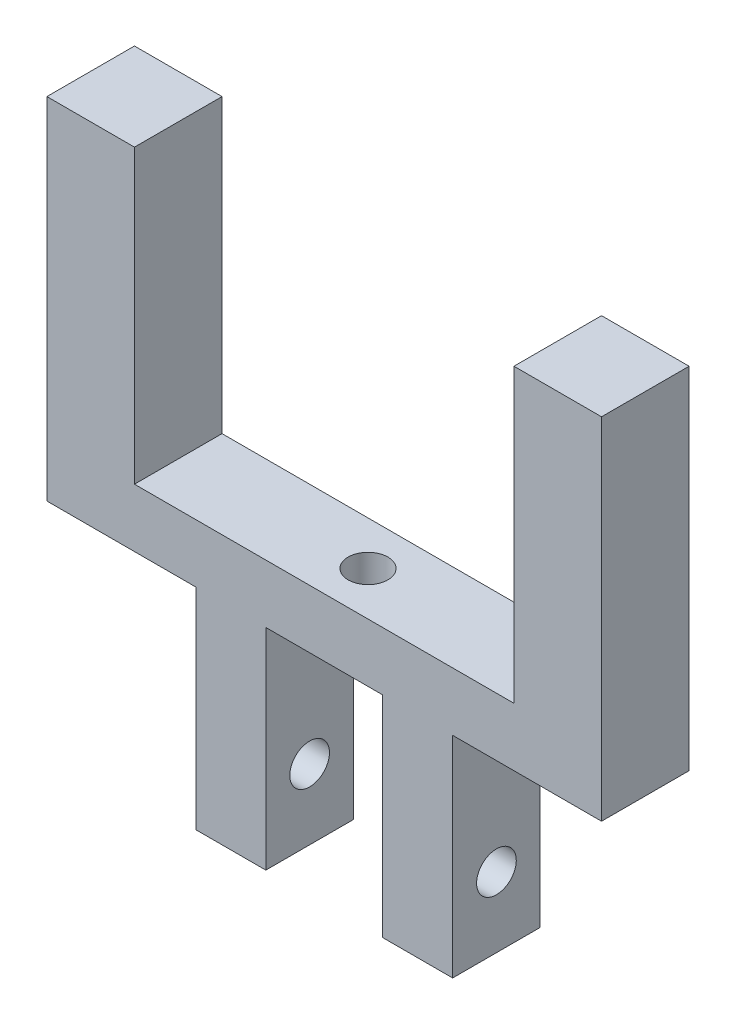
ISO-10303-21;
HEADER;
FILE_DESCRIPTION(('STEP AP214'),'2;1');
FILE_NAME('part.step','',(''),(''),'','','');
FILE_SCHEMA(('AUTOMOTIVE_DESIGN { 1 0 10303 214 1 1 1 1 }'));
ENDSEC;
DATA;
#1=APPLICATION_CONTEXT('core data for automotive mechanical design processes');
#2=APPLICATION_PROTOCOL_DEFINITION('international standard','automotive_design',2000,#1);
#3=PRODUCT_CONTEXT('',#1,'mechanical');
#4=PRODUCT('Part','Part','',(#3));
#5=PRODUCT_RELATED_PRODUCT_CATEGORY('part','',(#4));
#6=PRODUCT_DEFINITION_FORMATION('','',#4);
#7=PRODUCT_DEFINITION_CONTEXT('part definition',#1,'design');
#8=PRODUCT_DEFINITION('design','',#6,#7);
#9=PRODUCT_DEFINITION_SHAPE('','',#8);
#10=(LENGTH_UNIT() NAMED_UNIT(*) SI_UNIT(.MILLI.,.METRE.));
#11=(NAMED_UNIT(*) PLANE_ANGLE_UNIT() SI_UNIT($,.RADIAN.));
#12=(NAMED_UNIT(*) SI_UNIT($,.STERADIAN.) SOLID_ANGLE_UNIT());
#13=UNCERTAINTY_MEASURE_WITH_UNIT(LENGTH_MEASURE(1.E-05),#10,'distance_accuracy_value','');
#14=(GEOMETRIC_REPRESENTATION_CONTEXT(3) GLOBAL_UNCERTAINTY_ASSIGNED_CONTEXT((#13)) GLOBAL_UNIT_ASSIGNED_CONTEXT((#10,
#11,#12)) REPRESENTATION_CONTEXT('',''));
#15=CARTESIAN_POINT('',(0.,0.,0.));
#16=DIRECTION('',(0.,0.,1.));
#17=DIRECTION('',(1.,0.,0.));
#18=AXIS2_PLACEMENT_3D('',#15,#16,#17);
#19=CARTESIAN_POINT('',(-16.25,0.,7.5));
#20=DIRECTION('',(0.,-1.,0.));
#21=DIRECTION('',(1.,0.,0.));
#22=AXIS2_PLACEMENT_3D('',#19,#20,#21);
#23=PLANE('',#22);
#24=DIRECTION('',(-1.,0.,0.));
#25=VECTOR('',#24,1.);
#26=CARTESIAN_POINT('',(-16.25,0.,0.));
#27=LINE('',#26,#25);
#28=CARTESIAN_POINT('',(-16.25,0.,0.));
#29=VERTEX_POINT('',#28);
#30=CARTESIAN_POINT('',(-23.75,0.,0.));
#31=VERTEX_POINT('',#30);
#32=EDGE_CURVE('E146',#29,#31,#27,.T.);
#33=ORIENTED_EDGE('',*,*,#32,.T.);
#34=DIRECTION('',(0.,0.,-1.));
#35=VECTOR('',#34,1.);
#36=CARTESIAN_POINT('',(-23.75,0.,7.5));
#37=LINE('',#36,#35);
#38=CARTESIAN_POINT('',(-23.75,0.,7.5));
#39=VERTEX_POINT('',#38);
#40=EDGE_CURVE('E11',#39,#31,#37,.T.);
#41=ORIENTED_EDGE('',*,*,#40,.F.);
#42=DIRECTION('',(-1.,0.,0.));
#43=VECTOR('',#42,1.);
#44=CARTESIAN_POINT('',(-16.25,0.,7.5));
#45=LINE('',#44,#43);
#46=CARTESIAN_POINT('',(-16.25,0.,7.5));
#47=VERTEX_POINT('',#46);
#48=EDGE_CURVE('E164',#47,#39,#45,.T.);
#49=ORIENTED_EDGE('',*,*,#48,.F.);
#50=DIRECTION('',(0.,0.,-1.));
#51=VECTOR('',#50,1.);
#52=CARTESIAN_POINT('',(-16.25,0.,7.5));
#53=LINE('',#52,#51);
#54=EDGE_CURVE('E145',#47,#29,#53,.T.);
#55=ORIENTED_EDGE('',*,*,#54,.T.);
#56=EDGE_LOOP('',(#33,#41,#49,#55));
#57=FACE_BOUND('',#56,.T.);
#58=ADVANCED_FACE('F33',(#57),#23,.F.);
#59=CARTESIAN_POINT('',(-23.75,0.,7.5));
#60=DIRECTION('',(1.,0.,0.));
#61=DIRECTION('',(0.,1.,0.));
#62=AXIS2_PLACEMENT_3D('',#59,#60,#61);
#63=PLANE('',#62);
#64=DIRECTION('',(0.,-1.,0.));
#65=VECTOR('',#64,1.);
#66=CARTESIAN_POINT('',(-23.75,0.,0.));
#67=LINE('',#66,#65);
#68=CARTESIAN_POINT('',(-23.75,-30.,0.));
#69=VERTEX_POINT('',#68);
#70=EDGE_CURVE('E149',#31,#69,#67,.T.);
#71=ORIENTED_EDGE('',*,*,#70,.T.);
#72=DIRECTION('',(0.,0.,-1.));
#73=VECTOR('',#72,1.);
#74=CARTESIAN_POINT('',(-23.75,-30.,7.5));
#75=LINE('',#74,#73);
#76=CARTESIAN_POINT('',(-23.75,-30.,7.5));
#77=VERTEX_POINT('',#76);
#78=EDGE_CURVE('E42',#77,#69,#75,.T.);
#79=ORIENTED_EDGE('',*,*,#78,.F.);
#80=DIRECTION('',(0.,-1.,0.));
#81=VECTOR('',#80,1.);
#82=CARTESIAN_POINT('',(-23.75,0.,7.5));
#83=LINE('',#82,#81);
#84=EDGE_CURVE('E94',#39,#77,#83,.T.);
#85=ORIENTED_EDGE('',*,*,#84,.F.);
#86=ORIENTED_EDGE('',*,*,#40,.T.);
#87=EDGE_LOOP('',(#71,#79,#85,#86));
#88=FACE_BOUND('',#87,.T.);
#89=ADVANCED_FACE('F292',(#88),#63,.F.);
#90=CARTESIAN_POINT('',(-23.75,-30.,7.5));
#91=DIRECTION('',(0.,1.,0.));
#92=DIRECTION('',(0.,0.,1.));
#93=AXIS2_PLACEMENT_3D('',#90,#91,#92);
#94=PLANE('',#93);
#95=DIRECTION('',(1.,0.,0.));
#96=VECTOR('',#95,1.);
#97=CARTESIAN_POINT('',(-23.75,-30.,0.));
#98=LINE('',#97,#96);
#99=CARTESIAN_POINT('',(-11.,-30.,0.));
#100=VERTEX_POINT('',#99);
#101=EDGE_CURVE('E152',#69,#100,#98,.T.);
#102=ORIENTED_EDGE('',*,*,#101,.T.);
#103=DIRECTION('',(0.,0.,-1.));
#104=VECTOR('',#103,1.);
#105=CARTESIAN_POINT('',(-11.,-30.,7.5));
#106=LINE('',#105,#104);
#107=CARTESIAN_POINT('',(-11.,-30.,7.5));
#108=VERTEX_POINT('',#107);
#109=EDGE_CURVE('E171',#108,#100,#106,.T.);
#110=ORIENTED_EDGE('',*,*,#109,.F.);
#111=DIRECTION('',(1.,0.,0.));
#112=VECTOR('',#111,1.);
#113=CARTESIAN_POINT('',(-23.75,-30.,7.5));
#114=LINE('',#113,#112);
#115=EDGE_CURVE('E180',#77,#108,#114,.T.);
#116=ORIENTED_EDGE('',*,*,#115,.F.);
#117=ORIENTED_EDGE('',*,*,#78,.T.);
#118=EDGE_LOOP('',(#102,#110,#116,#117));
#119=FACE_BOUND('',#118,.T.);
#120=ADVANCED_FACE('F178',(#119),#94,.F.);
#121=CARTESIAN_POINT('',(-11.,-48.,7.5));
#122=DIRECTION('',(1.,0.,0.));
#123=DIRECTION('',(0.,1.,0.));
#124=AXIS2_PLACEMENT_3D('',#121,#122,#123);
#125=PLANE('',#124);
#126=CARTESIAN_POINT('',(-11.,-42.,3.75));
#127=DIRECTION('',(1.,0.,0.));
#128=DIRECTION('',(0.,1.,0.));
#129=AXIS2_PLACEMENT_3D('',#126,#127,#128);
#130=CIRCLE('',#129,1.7);
#131=CARTESIAN_POINT('',(-11.,-40.3,3.75));
#132=VERTEX_POINT('',#131);
#133=EDGE_CURVE('E241',#132,#132,#130,.T.);
#134=ORIENTED_EDGE('',*,*,#133,.T.);
#135=EDGE_LOOP('',(#134));
#136=FACE_BOUND('',#135,.T.);
#137=DIRECTION('',(0.,-1.,0.));
#138=VECTOR('',#137,1.);
#139=CARTESIAN_POINT('',(-11.,-48.,0.));
#140=LINE('',#139,#138);
#141=CARTESIAN_POINT('',(-11.,-48.,0.));
#142=VERTEX_POINT('',#141);
#143=EDGE_CURVE('E154',#100,#142,#140,.T.);
#144=ORIENTED_EDGE('',*,*,#143,.T.);
#145=DIRECTION('',(0.,0.,-1.));
#146=VECTOR('',#145,1.);
#147=CARTESIAN_POINT('',(-11.,-48.,7.5));
#148=LINE('',#147,#146);
#149=CARTESIAN_POINT('',(-11.,-48.,7.5));
#150=VERTEX_POINT('',#149);
#151=EDGE_CURVE('E168',#150,#142,#148,.T.);
#152=ORIENTED_EDGE('',*,*,#151,.F.);
#153=DIRECTION('',(0.,-1.,0.));
#154=VECTOR('',#153,1.);
#155=CARTESIAN_POINT('',(-11.,-48.,7.5));
#156=LINE('',#155,#154);
#157=EDGE_CURVE('E192',#108,#150,#156,.T.);
#158=ORIENTED_EDGE('',*,*,#157,.F.);
#159=ORIENTED_EDGE('',*,*,#109,.T.);
#160=EDGE_LOOP('',(#144,#152,#158,#159));
#161=FACE_BOUND('',#160,.T.);
#162=ADVANCED_FACE('F188',(#136,#161),#125,.F.);
#163=CARTESIAN_POINT('',(-11.,-48.,7.5));
#164=DIRECTION('',(0.,1.,0.));
#165=DIRECTION('',(0.,0.,1.));
#166=AXIS2_PLACEMENT_3D('',#163,#164,#165);
#167=PLANE('',#166);
#168=DIRECTION('',(1.,0.,0.));
#169=VECTOR('',#168,1.);
#170=CARTESIAN_POINT('',(-11.,-48.,0.));
#171=LINE('',#170,#169);
#172=CARTESIAN_POINT('',(-4.99999999999999,-48.,0.));
#173=VERTEX_POINT('',#172);
#174=EDGE_CURVE('E156',#142,#173,#171,.T.);
#175=ORIENTED_EDGE('',*,*,#174,.T.);
#176=DIRECTION('',(0.,0.,-1.));
#177=VECTOR('',#176,1.);
#178=CARTESIAN_POINT('',(-4.99999999999999,-48.,7.5));
#179=LINE('',#178,#177);
#180=CARTESIAN_POINT('',(-4.99999999999999,-48.,7.5));
#181=VERTEX_POINT('',#180);
#182=EDGE_CURVE('E132',#181,#173,#179,.T.);
#183=ORIENTED_EDGE('',*,*,#182,.F.);
#184=DIRECTION('',(1.,0.,0.));
#185=VECTOR('',#184,1.);
#186=CARTESIAN_POINT('',(-11.,-48.,7.5));
#187=LINE('',#186,#185);
#188=EDGE_CURVE('E120',#150,#181,#187,.T.);
#189=ORIENTED_EDGE('',*,*,#188,.F.);
#190=ORIENTED_EDGE('',*,*,#151,.T.);
#191=EDGE_LOOP('',(#175,#183,#189,#190));
#192=FACE_BOUND('',#191,.T.);
#193=ADVANCED_FACE('F191',(#192),#167,.F.);
#194=CARTESIAN_POINT('',(-5.,-40.,7.5));
#195=DIRECTION('',(-1.,0.,0.));
#196=DIRECTION('',(0.,0.,1.));
#197=AXIS2_PLACEMENT_3D('',#194,#195,#196);
#198=PLANE('',#197);
#199=CARTESIAN_POINT('',(-5.,-42.,3.75));
#200=DIRECTION('',(-1.,0.,0.));
#201=DIRECTION('',(0.,0.,1.));
#202=AXIS2_PLACEMENT_3D('',#199,#200,#201);
#203=CIRCLE('',#202,1.7);
#204=CARTESIAN_POINT('',(-5.,-42.,5.45));
#205=VERTEX_POINT('',#204);
#206=EDGE_CURVE('E262',#205,#205,#203,.T.);
#207=ORIENTED_EDGE('',*,*,#206,.T.);
#208=EDGE_LOOP('',(#207));
#209=FACE_BOUND('',#208,.T.);
#210=DIRECTION('',(0.,1.,0.));
#211=VECTOR('',#210,1.);
#212=CARTESIAN_POINT('',(-5.,-40.,0.));
#213=LINE('',#212,#211);
#214=CARTESIAN_POINT('',(-5.,-30.,0.));
#215=VERTEX_POINT('',#214);
#216=EDGE_CURVE('E128',#173,#215,#213,.T.);
#217=ORIENTED_EDGE('',*,*,#216,.T.);
#218=DIRECTION('',(0.,0.,-1.));
#219=VECTOR('',#218,1.);
#220=CARTESIAN_POINT('',(-5.,-30.,7.5));
#221=LINE('',#220,#219);
#222=CARTESIAN_POINT('',(-5.,-30.,7.5));
#223=VERTEX_POINT('',#222);
#224=EDGE_CURVE('E126',#223,#215,#221,.T.);
#225=ORIENTED_EDGE('',*,*,#224,.F.);
#226=DIRECTION('',(0.,1.,0.));
#227=VECTOR('',#226,1.);
#228=CARTESIAN_POINT('',(-4.99999999999999,-48.,7.5));
#229=LINE('',#228,#227);
#230=EDGE_CURVE('E111',#181,#223,#229,.T.);
#231=ORIENTED_EDGE('',*,*,#230,.F.);
#232=ORIENTED_EDGE('',*,*,#182,.T.);
#233=EDGE_LOOP('',(#217,#225,#231,#232));
#234=FACE_BOUND('',#233,.T.);
#235=ADVANCED_FACE('F127',(#209,#234),#198,.F.);
#236=CARTESIAN_POINT('',(-5.,-30.,7.5));
#237=DIRECTION('',(0.,1.,0.));
#238=DIRECTION('',(0.,0.,1.));
#239=AXIS2_PLACEMENT_3D('',#236,#237,#238);
#240=PLANE('',#239);
#241=CARTESIAN_POINT('',(0.,-30.,3.75));
#242=DIRECTION('',(0.,1.,0.));
#243=DIRECTION('',(0.,0.,1.));
#244=AXIS2_PLACEMENT_3D('',#241,#242,#243);
#245=CIRCLE('',#244,1.7);
#246=CARTESIAN_POINT('',(-1.70000000000001,-30.,3.75));
#247=VERTEX_POINT('',#246);
#248=EDGE_CURVE('E271',#247,#247,#245,.T.);
#249=ORIENTED_EDGE('',*,*,#248,.T.);
#250=EDGE_LOOP('',(#249));
#251=FACE_BOUND('',#250,.T.);
#252=DIRECTION('',(1.,0.,0.));
#253=VECTOR('',#252,1.);
#254=CARTESIAN_POINT('',(-5.,-30.,0.));
#255=LINE('',#254,#253);
#256=CARTESIAN_POINT('',(5.,-30.,0.));
#257=VERTEX_POINT('',#256);
#258=EDGE_CURVE('E160',#215,#257,#255,.T.);
#259=ORIENTED_EDGE('',*,*,#258,.T.);
#260=DIRECTION('',(0.,0.,-1.));
#261=VECTOR('',#260,1.);
#262=CARTESIAN_POINT('',(5.,-30.,7.5));
#263=LINE('',#262,#261);
#264=CARTESIAN_POINT('',(5.,-30.,7.5));
#265=VERTEX_POINT('',#264);
#266=EDGE_CURVE('E137',#265,#257,#263,.T.);
#267=ORIENTED_EDGE('',*,*,#266,.F.);
#268=DIRECTION('',(1.,0.,0.));
#269=VECTOR('',#268,1.);
#270=CARTESIAN_POINT('',(-5.,-30.,7.5));
#271=LINE('',#270,#269);
#272=EDGE_CURVE('E117',#223,#265,#271,.T.);
#273=ORIENTED_EDGE('',*,*,#272,.F.);
#274=ORIENTED_EDGE('',*,*,#224,.T.);
#275=EDGE_LOOP('',(#259,#267,#273,#274));
#276=FACE_BOUND('',#275,.T.);
#277=ADVANCED_FACE('F135',(#251,#276),#240,.F.);
#278=CARTESIAN_POINT('',(0.,-25.,7.5));
#279=DIRECTION('',(0.,-1.,0.));
#280=DIRECTION('',(0.,0.,-1.));
#281=AXIS2_PLACEMENT_3D('',#278,#279,#280);
#282=PLANE('',#281);
#283=CARTESIAN_POINT('',(0.,-25.,3.75));
#284=DIRECTION('',(0.,-1.,0.));
#285=DIRECTION('',(0.,0.,-1.));
#286=AXIS2_PLACEMENT_3D('',#283,#284,#285);
#287=CIRCLE('',#286,1.7);
#288=CARTESIAN_POINT('',(-1.70000000000001,-25.,3.75));
#289=VERTEX_POINT('',#288);
#290=EDGE_CURVE('E36',#289,#289,#287,.T.);
#291=ORIENTED_EDGE('',*,*,#290,.T.);
#292=EDGE_LOOP('',(#291));
#293=FACE_BOUND('',#292,.T.);
#294=DIRECTION('',(-1.,0.,0.));
#295=VECTOR('',#294,1.);
#296=CARTESIAN_POINT('',(0.,-25.,0.));
#297=LINE('',#296,#295);
#298=CARTESIAN_POINT('',(16.25,-25.,0.));
#299=VERTEX_POINT('',#298);
#300=CARTESIAN_POINT('',(-16.25,-25.,0.));
#301=VERTEX_POINT('',#300);
#302=EDGE_CURVE('E80',#299,#301,#297,.T.);
#303=ORIENTED_EDGE('',*,*,#302,.T.);
#304=DIRECTION('',(0.,0.,-1.));
#305=VECTOR('',#304,1.);
#306=CARTESIAN_POINT('',(-16.25,-25.,7.5));
#307=LINE('',#306,#305);
#308=CARTESIAN_POINT('',(-16.25,-25.,7.5));
#309=VERTEX_POINT('',#308);
#310=EDGE_CURVE('E133',#309,#301,#307,.T.);
#311=ORIENTED_EDGE('',*,*,#310,.F.);
#312=DIRECTION('',(-1.,0.,0.));
#313=VECTOR('',#312,1.);
#314=CARTESIAN_POINT('',(0.,-25.,7.5));
#315=LINE('',#314,#313);
#316=CARTESIAN_POINT('',(16.25,-25.,7.5));
#317=VERTEX_POINT('',#316);
#318=EDGE_CURVE('E139',#317,#309,#315,.T.);
#319=ORIENTED_EDGE('',*,*,#318,.F.);
#320=DIRECTION('',(0.,0.,-1.));
#321=VECTOR('',#320,1.);
#322=CARTESIAN_POINT('',(16.25,-25.,7.5));
#323=LINE('',#322,#321);
#324=EDGE_CURVE('E200',#317,#299,#323,.T.);
#325=ORIENTED_EDGE('',*,*,#324,.T.);
#326=EDGE_LOOP('',(#303,#311,#319,#325));
#327=FACE_BOUND('',#326,.T.);
#328=ADVANCED_FACE('F278',(#293,#327),#282,.F.);
#329=CARTESIAN_POINT('',(-16.25,-25.,7.5));
#330=DIRECTION('',(-1.,0.,0.));
#331=DIRECTION('',(0.,-1.,0.));
#332=AXIS2_PLACEMENT_3D('',#329,#330,#331);
#333=PLANE('',#332);
#334=DIRECTION('',(0.,1.,0.));
#335=VECTOR('',#334,1.);
#336=CARTESIAN_POINT('',(-16.25,-25.,0.));
#337=LINE('',#336,#335);
#338=EDGE_CURVE('E86',#301,#29,#337,.T.);
#339=ORIENTED_EDGE('',*,*,#338,.T.);
#340=ORIENTED_EDGE('',*,*,#54,.F.);
#341=DIRECTION('',(0.,1.,0.));
#342=VECTOR('',#341,1.);
#343=CARTESIAN_POINT('',(-16.25,-25.,7.5));
#344=LINE('',#343,#342);
#345=EDGE_CURVE('E50',#309,#47,#344,.T.);
#346=ORIENTED_EDGE('',*,*,#345,.F.);
#347=ORIENTED_EDGE('',*,*,#310,.T.);
#348=EDGE_LOOP('',(#339,#340,#346,#347));
#349=FACE_BOUND('',#348,.T.);
#350=ADVANCED_FACE('F361',(#349),#333,.F.);
#351=CARTESIAN_POINT('',(0.,0.,7.5));
#352=DIRECTION('',(0.,0.,1.));
#353=DIRECTION('',(1.,0.,0.));
#354=AXIS2_PLACEMENT_3D('',#351,#352,#353);
#355=PLANE('',#354);
#356=ORIENTED_EDGE('',*,*,#48,.T.);
#357=ORIENTED_EDGE('',*,*,#84,.T.);
#358=ORIENTED_EDGE('',*,*,#115,.T.);
#359=ORIENTED_EDGE('',*,*,#157,.T.);
#360=ORIENTED_EDGE('',*,*,#188,.T.);
#361=ORIENTED_EDGE('',*,*,#230,.T.);
#362=ORIENTED_EDGE('',*,*,#272,.T.);
#363=DIRECTION('',(0.,1.,0.));
#364=VECTOR('',#363,1.);
#365=CARTESIAN_POINT('',(5.,-40.,7.5));
#366=LINE('',#365,#364);
#367=CARTESIAN_POINT('',(4.99999999999999,-48.,7.5));
#368=VERTEX_POINT('',#367);
#369=EDGE_CURVE('E253',#368,#265,#366,.T.);
#370=ORIENTED_EDGE('',*,*,#369,.F.);
#371=DIRECTION('',(-1.,0.,0.));
#372=VECTOR('',#371,1.);
#373=CARTESIAN_POINT('',(11.,-48.,7.5));
#374=LINE('',#373,#372);
#375=CARTESIAN_POINT('',(11.,-48.,7.5));
#376=VERTEX_POINT('',#375);
#377=EDGE_CURVE('E250',#376,#368,#374,.T.);
#378=ORIENTED_EDGE('',*,*,#377,.F.);
#379=DIRECTION('',(0.,-1.,0.));
#380=VECTOR('',#379,1.);
#381=CARTESIAN_POINT('',(11.,-48.,7.5));
#382=LINE('',#381,#380);
#383=CARTESIAN_POINT('',(11.,-30.,7.5));
#384=VERTEX_POINT('',#383);
#385=EDGE_CURVE('E247',#384,#376,#382,.T.);
#386=ORIENTED_EDGE('',*,*,#385,.F.);
#387=DIRECTION('',(-1.,0.,0.));
#388=VECTOR('',#387,1.);
#389=CARTESIAN_POINT('',(23.75,-30.,7.5));
#390=LINE('',#389,#388);
#391=CARTESIAN_POINT('',(23.75,-30.,7.5));
#392=VERTEX_POINT('',#391);
#393=EDGE_CURVE('E244',#392,#384,#390,.T.);
#394=ORIENTED_EDGE('',*,*,#393,.F.);
#395=DIRECTION('',(0.,-1.,0.));
#396=VECTOR('',#395,1.);
#397=CARTESIAN_POINT('',(23.75,0.,7.5));
#398=LINE('',#397,#396);
#399=CARTESIAN_POINT('',(23.75,0.,7.5));
#400=VERTEX_POINT('',#399);
#401=EDGE_CURVE('E218',#400,#392,#398,.T.);
#402=ORIENTED_EDGE('',*,*,#401,.F.);
#403=DIRECTION('',(1.,0.,0.));
#404=VECTOR('',#403,1.);
#405=CARTESIAN_POINT('',(16.25,0.,7.5));
#406=LINE('',#405,#404);
#407=CARTESIAN_POINT('',(16.25,0.,7.5));
#408=VERTEX_POINT('',#407);
#409=EDGE_CURVE('E222',#408,#400,#406,.T.);
#410=ORIENTED_EDGE('',*,*,#409,.F.);
#411=DIRECTION('',(0.,1.,0.));
#412=VECTOR('',#411,1.);
#413=CARTESIAN_POINT('',(16.25,-25.,7.5));
#414=LINE('',#413,#412);
#415=EDGE_CURVE('E255',#317,#408,#414,.T.);
#416=ORIENTED_EDGE('',*,*,#415,.F.);
#417=ORIENTED_EDGE('',*,*,#318,.T.);
#418=ORIENTED_EDGE('',*,*,#345,.T.);
#419=EDGE_LOOP('',(#356,#357,#358,#359,#360,#361,#362,#370,#378,#386,#394,#402,#410,#416,#417,#418));
#420=FACE_BOUND('',#419,.T.);
#421=ADVANCED_FACE('F113',(#420),#355,.T.);
#422=CARTESIAN_POINT('',(0.,0.,0.));
#423=DIRECTION('',(0.,0.,1.));
#424=DIRECTION('',(1.,0.,0.));
#425=AXIS2_PLACEMENT_3D('',#422,#423,#424);
#426=PLANE('',#425);
#427=ORIENTED_EDGE('',*,*,#32,.F.);
#428=ORIENTED_EDGE('',*,*,#338,.F.);
#429=ORIENTED_EDGE('',*,*,#302,.F.);
#430=DIRECTION('',(0.,1.,0.));
#431=VECTOR('',#430,1.);
#432=CARTESIAN_POINT('',(16.25,-25.,0.));
#433=LINE('',#432,#431);
#434=CARTESIAN_POINT('',(16.25,0.,0.));
#435=VERTEX_POINT('',#434);
#436=EDGE_CURVE('E235',#299,#435,#433,.T.);
#437=ORIENTED_EDGE('',*,*,#436,.T.);
#438=DIRECTION('',(1.,0.,0.));
#439=VECTOR('',#438,1.);
#440=CARTESIAN_POINT('',(16.25,0.,0.));
#441=LINE('',#440,#439);
#442=CARTESIAN_POINT('',(23.75,0.,0.));
#443=VERTEX_POINT('',#442);
#444=EDGE_CURVE('E238',#435,#443,#441,.T.);
#445=ORIENTED_EDGE('',*,*,#444,.T.);
#446=DIRECTION('',(0.,-1.,0.));
#447=VECTOR('',#446,1.);
#448=CARTESIAN_POINT('',(23.75,0.,0.));
#449=LINE('',#448,#447);
#450=CARTESIAN_POINT('',(23.75,-30.,0.));
#451=VERTEX_POINT('',#450);
#452=EDGE_CURVE('E219',#443,#451,#449,.T.);
#453=ORIENTED_EDGE('',*,*,#452,.T.);
#454=DIRECTION('',(-1.,0.,0.));
#455=VECTOR('',#454,1.);
#456=CARTESIAN_POINT('',(23.75,-30.,0.));
#457=LINE('',#456,#455);
#458=CARTESIAN_POINT('',(11.,-30.,0.));
#459=VERTEX_POINT('',#458);
#460=EDGE_CURVE('E223',#451,#459,#457,.T.);
#461=ORIENTED_EDGE('',*,*,#460,.T.);
#462=DIRECTION('',(0.,-1.,0.));
#463=VECTOR('',#462,1.);
#464=CARTESIAN_POINT('',(11.,-48.,0.));
#465=LINE('',#464,#463);
#466=CARTESIAN_POINT('',(11.,-48.,0.));
#467=VERTEX_POINT('',#466);
#468=EDGE_CURVE('E226',#459,#467,#465,.T.);
#469=ORIENTED_EDGE('',*,*,#468,.T.);
#470=DIRECTION('',(-1.,0.,0.));
#471=VECTOR('',#470,1.);
#472=CARTESIAN_POINT('',(11.,-48.,0.));
#473=LINE('',#472,#471);
#474=CARTESIAN_POINT('',(4.99999999999999,-48.,0.));
#475=VERTEX_POINT('',#474);
#476=EDGE_CURVE('E229',#467,#475,#473,.T.);
#477=ORIENTED_EDGE('',*,*,#476,.T.);
#478=DIRECTION('',(0.,1.,0.));
#479=VECTOR('',#478,1.);
#480=CARTESIAN_POINT('',(4.99999999999999,-48.,0.));
#481=LINE('',#480,#479);
#482=EDGE_CURVE('E232',#475,#257,#481,.T.);
#483=ORIENTED_EDGE('',*,*,#482,.T.);
#484=ORIENTED_EDGE('',*,*,#258,.F.);
#485=ORIENTED_EDGE('',*,*,#216,.F.);
#486=ORIENTED_EDGE('',*,*,#174,.F.);
#487=ORIENTED_EDGE('',*,*,#143,.F.);
#488=ORIENTED_EDGE('',*,*,#101,.F.);
#489=ORIENTED_EDGE('',*,*,#70,.F.);
#490=EDGE_LOOP('',(#427,#428,#429,#437,#445,#453,#461,#469,#477,#483,#484,#485,#486,#487,#488,#489));
#491=FACE_BOUND('',#490,.T.);
#492=ADVANCED_FACE('F184',(#491),#426,.F.);
#493=CARTESIAN_POINT('',(16.25,0.,7.5));
#494=DIRECTION('',(0.,1.,0.));
#495=DIRECTION('',(-1.,0.,0.));
#496=AXIS2_PLACEMENT_3D('',#493,#494,#495);
#497=PLANE('',#496);
#498=ORIENTED_EDGE('',*,*,#444,.F.);
#499=DIRECTION('',(0.,0.,-1.));
#500=VECTOR('',#499,1.);
#501=CARTESIAN_POINT('',(16.25,0.,7.5));
#502=LINE('',#501,#500);
#503=EDGE_CURVE('E150',#408,#435,#502,.T.);
#504=ORIENTED_EDGE('',*,*,#503,.F.);
#505=ORIENTED_EDGE('',*,*,#409,.T.);
#506=DIRECTION('',(0.,0.,-1.));
#507=VECTOR('',#506,1.);
#508=CARTESIAN_POINT('',(23.75,0.,7.5));
#509=LINE('',#508,#507);
#510=EDGE_CURVE('E215',#400,#443,#509,.T.);
#511=ORIENTED_EDGE('',*,*,#510,.T.);
#512=EDGE_LOOP('',(#498,#504,#505,#511));
#513=FACE_BOUND('',#512,.T.);
#514=ADVANCED_FACE('F316',(#513),#497,.T.);
#515=CARTESIAN_POINT('',(16.25,-25.,7.5));
#516=DIRECTION('',(-1.,0.,0.));
#517=DIRECTION('',(0.,-1.,0.));
#518=AXIS2_PLACEMENT_3D('',#515,#516,#517);
#519=PLANE('',#518);
#520=ORIENTED_EDGE('',*,*,#436,.F.);
#521=ORIENTED_EDGE('',*,*,#324,.F.);
#522=ORIENTED_EDGE('',*,*,#415,.T.);
#523=ORIENTED_EDGE('',*,*,#503,.T.);
#524=EDGE_LOOP('',(#520,#521,#522,#523));
#525=FACE_BOUND('',#524,.T.);
#526=ADVANCED_FACE('F309',(#525),#519,.T.);
#527=CARTESIAN_POINT('',(4.99999999999999,-48.,7.5));
#528=DIRECTION('',(-1.,0.,0.));
#529=DIRECTION('',(0.,-1.,0.));
#530=AXIS2_PLACEMENT_3D('',#527,#528,#529);
#531=PLANE('',#530);
#532=CARTESIAN_POINT('',(4.99999999999999,-42.,3.75));
#533=DIRECTION('',(-1.,0.,0.));
#534=DIRECTION('',(0.,-1.,0.));
#535=AXIS2_PLACEMENT_3D('',#532,#533,#534);
#536=CIRCLE('',#535,1.7);
#537=CARTESIAN_POINT('',(4.99999999999999,-43.7,3.75));
#538=VERTEX_POINT('',#537);
#539=EDGE_CURVE('E265',#538,#538,#536,.T.);
#540=ORIENTED_EDGE('',*,*,#539,.F.);
#541=EDGE_LOOP('',(#540));
#542=FACE_BOUND('',#541,.T.);
#543=ORIENTED_EDGE('',*,*,#482,.F.);
#544=DIRECTION('',(0.,0.,-1.));
#545=VECTOR('',#544,1.);
#546=CARTESIAN_POINT('',(4.99999999999999,-48.,7.5));
#547=LINE('',#546,#545);
#548=EDGE_CURVE('E203',#368,#475,#547,.T.);
#549=ORIENTED_EDGE('',*,*,#548,.F.);
#550=ORIENTED_EDGE('',*,*,#369,.T.);
#551=ORIENTED_EDGE('',*,*,#266,.T.);
#552=EDGE_LOOP('',(#543,#549,#550,#551));
#553=FACE_BOUND('',#552,.T.);
#554=ADVANCED_FACE('F355',(#542,#553),#531,.T.);
#555=CARTESIAN_POINT('',(11.,-48.,7.5));
#556=DIRECTION('',(0.,-1.,0.));
#557=DIRECTION('',(1.,0.,0.));
#558=AXIS2_PLACEMENT_3D('',#555,#556,#557);
#559=PLANE('',#558);
#560=ORIENTED_EDGE('',*,*,#476,.F.);
#561=DIRECTION('',(0.,0.,-1.));
#562=VECTOR('',#561,1.);
#563=CARTESIAN_POINT('',(11.,-48.,7.5));
#564=LINE('',#563,#562);
#565=EDGE_CURVE('E206',#376,#467,#564,.T.);
#566=ORIENTED_EDGE('',*,*,#565,.F.);
#567=ORIENTED_EDGE('',*,*,#377,.T.);
#568=ORIENTED_EDGE('',*,*,#548,.T.);
#569=EDGE_LOOP('',(#560,#566,#567,#568));
#570=FACE_BOUND('',#569,.T.);
#571=ADVANCED_FACE('F358',(#570),#559,.T.);
#572=CARTESIAN_POINT('',(11.,-48.,7.5));
#573=DIRECTION('',(1.,0.,0.));
#574=DIRECTION('',(0.,1.,0.));
#575=AXIS2_PLACEMENT_3D('',#572,#573,#574);
#576=PLANE('',#575);
#577=CARTESIAN_POINT('',(11.,-42.,3.75));
#578=DIRECTION('',(1.,0.,0.));
#579=DIRECTION('',(0.,1.,0.));
#580=AXIS2_PLACEMENT_3D('',#577,#578,#579);
#581=CIRCLE('',#580,1.7);
#582=CARTESIAN_POINT('',(11.,-40.3,3.75));
#583=VERTEX_POINT('',#582);
#584=EDGE_CURVE('E268',#583,#583,#581,.T.);
#585=ORIENTED_EDGE('',*,*,#584,.F.);
#586=EDGE_LOOP('',(#585));
#587=FACE_BOUND('',#586,.T.);
#588=ORIENTED_EDGE('',*,*,#468,.F.);
#589=DIRECTION('',(0.,0.,-1.));
#590=VECTOR('',#589,1.);
#591=CARTESIAN_POINT('',(11.,-30.,7.5));
#592=LINE('',#591,#590);
#593=EDGE_CURVE('E209',#384,#459,#592,.T.);
#594=ORIENTED_EDGE('',*,*,#593,.F.);
#595=ORIENTED_EDGE('',*,*,#385,.T.);
#596=ORIENTED_EDGE('',*,*,#565,.T.);
#597=EDGE_LOOP('',(#588,#594,#595,#596));
#598=FACE_BOUND('',#597,.T.);
#599=ADVANCED_FACE('F360',(#587,#598),#576,.T.);
#600=CARTESIAN_POINT('',(23.75,-30.,7.5));
#601=DIRECTION('',(0.,-1.,0.));
#602=DIRECTION('',(1.,0.,0.));
#603=AXIS2_PLACEMENT_3D('',#600,#601,#602);
#604=PLANE('',#603);
#605=ORIENTED_EDGE('',*,*,#460,.F.);
#606=DIRECTION('',(0.,0.,-1.));
#607=VECTOR('',#606,1.);
#608=CARTESIAN_POINT('',(23.75,-30.,7.5));
#609=LINE('',#608,#607);
#610=EDGE_CURVE('E212',#392,#451,#609,.T.);
#611=ORIENTED_EDGE('',*,*,#610,.F.);
#612=ORIENTED_EDGE('',*,*,#393,.T.);
#613=ORIENTED_EDGE('',*,*,#593,.T.);
#614=EDGE_LOOP('',(#605,#611,#612,#613));
#615=FACE_BOUND('',#614,.T.);
#616=ADVANCED_FACE('F329',(#615),#604,.T.);
#617=CARTESIAN_POINT('',(23.75,0.,7.5));
#618=DIRECTION('',(1.,0.,0.));
#619=DIRECTION('',(0.,1.,0.));
#620=AXIS2_PLACEMENT_3D('',#617,#618,#619);
#621=PLANE('',#620);
#622=ORIENTED_EDGE('',*,*,#452,.F.);
#623=ORIENTED_EDGE('',*,*,#510,.F.);
#624=ORIENTED_EDGE('',*,*,#401,.T.);
#625=ORIENTED_EDGE('',*,*,#610,.T.);
#626=EDGE_LOOP('',(#622,#623,#624,#625));
#627=FACE_BOUND('',#626,.T.);
#628=ADVANCED_FACE('F321',(#627),#621,.T.);
#629=CARTESIAN_POINT('',(-23.75,-42.,3.75));
#630=DIRECTION('',(1.,0.,0.));
#631=DIRECTION('',(0.,1.,0.));
#632=AXIS2_PLACEMENT_3D('',#629,#630,#631);
#633=CYLINDRICAL_SURFACE('',#632,1.7);
#634=ORIENTED_EDGE('',*,*,#539,.T.);
#635=EDGE_LOOP('',(#634));
#636=FACE_BOUND('',#635,.T.);
#637=ORIENTED_EDGE('',*,*,#584,.T.);
#638=EDGE_LOOP('',(#637));
#639=FACE_BOUND('',#638,.T.);
#640=ADVANCED_FACE('F288',(#636,#639),#633,.F.);
#641=ORIENTED_EDGE('',*,*,#206,.F.);
#642=EDGE_LOOP('',(#641));
#643=FACE_BOUND('',#642,.T.);
#644=ORIENTED_EDGE('',*,*,#133,.F.);
#645=EDGE_LOOP('',(#644));
#646=FACE_BOUND('',#645,.T.);
#647=ADVANCED_FACE('F283',(#643,#646),#633,.F.);
#648=CARTESIAN_POINT('',(0.,-48.,3.75));
#649=DIRECTION('',(0.,1.,0.));
#650=DIRECTION('',(-1.,0.,0.));
#651=AXIS2_PLACEMENT_3D('',#648,#649,#650);
#652=CYLINDRICAL_SURFACE('',#651,1.7);
#653=CARTESIAN_POINT('',(-1.70000000000001,-25.,3.75));
#654=CARTESIAN_POINT('',(-1.70000000000001,-25.0520833333333,3.75));
#655=CARTESIAN_POINT('',(-1.70000000000001,-25.1041666666667,3.75));
#656=CARTESIAN_POINT('',(-1.70000000000001,-25.2083333333333,3.75));
#657=CARTESIAN_POINT('',(-1.70000000000001,-25.2604166666667,3.75));
#658=CARTESIAN_POINT('',(-1.70000000000001,-25.3645833333333,3.75));
#659=CARTESIAN_POINT('',(-1.70000000000001,-25.4166666666667,3.75));
#660=CARTESIAN_POINT('',(-1.70000000000001,-25.5208333333333,3.75));
#661=CARTESIAN_POINT('',(-1.70000000000001,-25.5729166666667,3.75));
#662=CARTESIAN_POINT('',(-1.70000000000001,-25.6770833333333,3.75));
#663=CARTESIAN_POINT('',(-1.70000000000001,-25.7291666666667,3.75));
#664=CARTESIAN_POINT('',(-1.70000000000001,-25.8333333333333,3.75));
#665=CARTESIAN_POINT('',(-1.70000000000001,-25.8854166666667,3.75));
#666=CARTESIAN_POINT('',(-1.70000000000001,-25.9895833333333,3.75));
#667=CARTESIAN_POINT('',(-1.70000000000001,-26.0416666666667,3.75));
#668=CARTESIAN_POINT('',(-1.70000000000001,-26.1458333333333,3.75));
#669=CARTESIAN_POINT('',(-1.70000000000001,-26.1979166666667,3.75));
#670=CARTESIAN_POINT('',(-1.70000000000001,-26.3020833333333,3.75));
#671=CARTESIAN_POINT('',(-1.70000000000001,-26.3541666666667,3.75));
#672=CARTESIAN_POINT('',(-1.70000000000001,-26.4583333333333,3.75));
#673=CARTESIAN_POINT('',(-1.70000000000001,-26.5104166666667,3.75));
#674=CARTESIAN_POINT('',(-1.70000000000001,-26.6145833333333,3.75));
#675=CARTESIAN_POINT('',(-1.70000000000001,-26.6666666666667,3.75));
#676=CARTESIAN_POINT('',(-1.70000000000001,-26.7708333333333,3.75));
#677=CARTESIAN_POINT('',(-1.70000000000001,-26.8229166666667,3.75));
#678=CARTESIAN_POINT('',(-1.70000000000001,-26.9270833333333,3.75));
#679=CARTESIAN_POINT('',(-1.70000000000001,-26.9791666666667,3.75));
#680=CARTESIAN_POINT('',(-1.70000000000001,-27.0833333333333,3.75));
#681=CARTESIAN_POINT('',(-1.70000000000001,-27.1354166666667,3.75));
#682=CARTESIAN_POINT('',(-1.70000000000001,-27.2395833333333,3.75));
#683=CARTESIAN_POINT('',(-1.70000000000001,-27.2916666666667,3.75));
#684=CARTESIAN_POINT('',(-1.70000000000001,-27.3958333333333,3.75));
#685=CARTESIAN_POINT('',(-1.70000000000001,-27.4479166666667,3.75));
#686=CARTESIAN_POINT('',(-1.70000000000001,-27.5520833333333,3.75));
#687=CARTESIAN_POINT('',(-1.70000000000001,-27.6041666666667,3.75));
#688=CARTESIAN_POINT('',(-1.70000000000001,-27.7083333333333,3.75));
#689=CARTESIAN_POINT('',(-1.70000000000001,-27.7604166666667,3.75));
#690=CARTESIAN_POINT('',(-1.70000000000001,-27.8645833333333,3.75));
#691=CARTESIAN_POINT('',(-1.70000000000001,-27.9166666666667,3.75));
#692=CARTESIAN_POINT('',(-1.70000000000001,-28.0208333333333,3.75));
#693=CARTESIAN_POINT('',(-1.70000000000001,-28.0729166666667,3.75));
#694=CARTESIAN_POINT('',(-1.70000000000001,-28.1770833333333,3.75));
#695=CARTESIAN_POINT('',(-1.70000000000001,-28.2291666666667,3.75));
#696=CARTESIAN_POINT('',(-1.70000000000001,-28.3333333333333,3.75));
#697=CARTESIAN_POINT('',(-1.70000000000001,-28.3854166666667,3.75));
#698=CARTESIAN_POINT('',(-1.70000000000001,-28.4895833333333,3.75));
#699=CARTESIAN_POINT('',(-1.70000000000001,-28.5416666666667,3.75));
#700=CARTESIAN_POINT('',(-1.70000000000001,-28.6458333333333,3.75));
#701=CARTESIAN_POINT('',(-1.70000000000001,-28.6979166666667,3.75));
#702=CARTESIAN_POINT('',(-1.70000000000001,-28.8020833333333,3.75));
#703=CARTESIAN_POINT('',(-1.70000000000001,-28.8541666666667,3.75));
#704=CARTESIAN_POINT('',(-1.70000000000001,-28.9583333333333,3.75));
#705=CARTESIAN_POINT('',(-1.70000000000001,-29.0104166666667,3.75));
#706=CARTESIAN_POINT('',(-1.70000000000001,-29.1145833333333,3.75));
#707=CARTESIAN_POINT('',(-1.70000000000001,-29.1666666666667,3.75));
#708=CARTESIAN_POINT('',(-1.70000000000001,-29.2708333333333,3.75));
#709=CARTESIAN_POINT('',(-1.70000000000001,-29.3229166666667,3.75));
#710=CARTESIAN_POINT('',(-1.70000000000001,-29.4270833333333,3.75));
#711=CARTESIAN_POINT('',(-1.70000000000001,-29.4791666666667,3.75));
#712=CARTESIAN_POINT('',(-1.70000000000001,-29.5833333333333,3.75));
#713=CARTESIAN_POINT('',(-1.70000000000001,-29.6354166666667,3.75));
#714=CARTESIAN_POINT('',(-1.70000000000001,-29.7395833333333,3.75));
#715=CARTESIAN_POINT('',(-1.70000000000001,-29.7916666666667,3.75));
#716=CARTESIAN_POINT('',(-1.70000000000001,-29.8958333333333,3.75));
#717=CARTESIAN_POINT('',(-1.70000000000001,-29.9479166666667,3.75));
#718=CARTESIAN_POINT('',(-1.70000000000001,-30.,3.75));
#719=B_SPLINE_CURVE_WITH_KNOTS('',3,(#653,#654,#655,#656,#657,#658,#659,#660,#661,#662,#663,
#664,#665,#666,#667,#668,#669,#670,#671,#672,#673,#674,#675,#676,#677,#678,#679,#680,#681,#682,
#683,#684,#685,#686,#687,#688,#689,#690,#691,#692,#693,#694,#695,#696,#697,#698,#699,#700,#701,
#702,#703,#704,#705,#706,#707,#708,#709,#710,#711,#712,#713,#714,#715,#716,#717,#718),
.UNSPECIFIED.,.F.,.F.,(4,2,2,2,2,2,2,2,2,2,2,2,2,2,2,2,2,2,2,2,2,2,2,2,2,2,2,2,2,2,2,2,4),(0.,
0.15625,0.3125,0.46875,0.625000000000001,0.781250000000001,0.937500000000001,1.09375,1.25,
1.40625,1.5625,1.71875,1.875,2.03125,2.1875,2.34375,2.5,2.65625,2.8125,2.96875,3.125,3.28125,
3.4375,3.59375,3.75,3.90625,4.0625,4.21875,4.375,4.53125,4.6875,4.84375,5.),.UNSPECIFIED.);
#720=EDGE_CURVE('BSEAM280',#289,#247,#719,.T.);
#721=ORIENTED_EDGE('',*,*,#290,.F.);
#722=ORIENTED_EDGE('',*,*,#248,.F.);
#723=ORIENTED_EDGE('',*,*,#720,.T.);
#724=ORIENTED_EDGE('',*,*,#720,.F.);
#725=EDGE_LOOP('',(#721,#723,#722,#724));
#726=FACE_BOUND('',#725,.T.);
#727=ADVANCED_FACE('F280',(#726),#652,.F.);
#728=CLOSED_SHELL('',(#58,#89,#120,#162,#193,#235,#277,#328,#350,#421,#492,#514,#526,#554,#571,
#599,#616,#628,#640,#647,#727));
#729=MANIFOLD_SOLID_BREP('B2',#728);
#730=ADVANCED_BREP_SHAPE_REPRESENTATION('',(#18,#729),#14);
#731=SHAPE_DEFINITION_REPRESENTATION(#9,#730);
ENDSEC;
END-ISO-10303-21;
